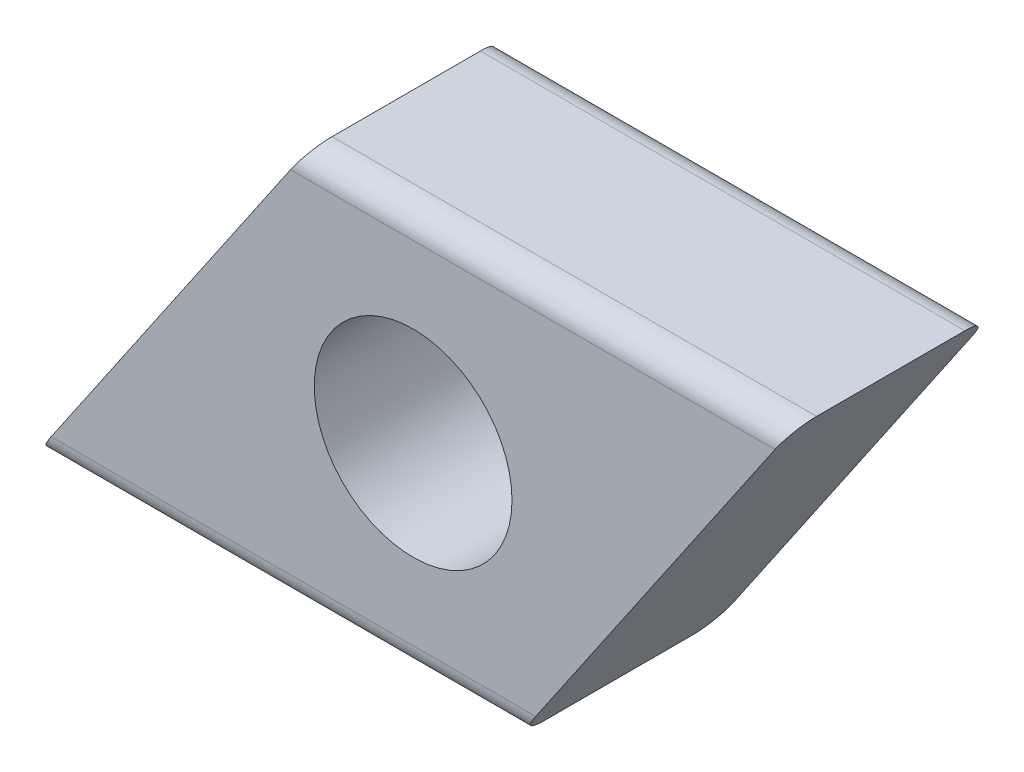
ISO-10303-21;
HEADER;
FILE_DESCRIPTION(('STEP AP214'),'2;1');
FILE_NAME('part.step','',(''),(''),'','','');
FILE_SCHEMA(('AUTOMOTIVE_DESIGN { 1 0 10303 214 1 1 1 1 }'));
ENDSEC;
DATA;
#1=APPLICATION_CONTEXT('core data for automotive mechanical design processes');
#2=APPLICATION_PROTOCOL_DEFINITION('international standard','automotive_design',2000,#1);
#3=PRODUCT_CONTEXT('',#1,'mechanical');
#4=PRODUCT('Part','Part','',(#3));
#5=PRODUCT_RELATED_PRODUCT_CATEGORY('part','',(#4));
#6=PRODUCT_DEFINITION_FORMATION('','',#4);
#7=PRODUCT_DEFINITION_CONTEXT('part definition',#1,'design');
#8=PRODUCT_DEFINITION('design','',#6,#7);
#9=PRODUCT_DEFINITION_SHAPE('','',#8);
#10=(LENGTH_UNIT() NAMED_UNIT(*) SI_UNIT(.MILLI.,.METRE.));
#11=(NAMED_UNIT(*) PLANE_ANGLE_UNIT() SI_UNIT($,.RADIAN.));
#12=(NAMED_UNIT(*) SI_UNIT($,.STERADIAN.) SOLID_ANGLE_UNIT());
#13=UNCERTAINTY_MEASURE_WITH_UNIT(LENGTH_MEASURE(1.E-05),#10,'distance_accuracy_value','');
#14=(GEOMETRIC_REPRESENTATION_CONTEXT(3) GLOBAL_UNCERTAINTY_ASSIGNED_CONTEXT((#13)) GLOBAL_UNIT_ASSIGNED_CONTEXT((#10,
#11,#12)) REPRESENTATION_CONTEXT('',''));
#15=CARTESIAN_POINT('',(0.,0.,0.));
#16=DIRECTION('',(0.,0.,1.));
#17=DIRECTION('',(1.,0.,0.));
#18=AXIS2_PLACEMENT_3D('',#15,#16,#17);
#19=CARTESIAN_POINT('',(0.,-1.11022302462516E-13,4.00000000000045));
#20=DIRECTION('',(0.826146788634581,-0.563454952617134,0.));
#21=DIRECTION('',(0.563454952617132,0.826146788634582,0.));
#22=AXIS2_PLACEMENT_3D('',#19,#20,#21);
#23=PLANE('',#22);
#24=DIRECTION('',(0.,0.,-0.999999999999999));
#25=VECTOR('',#24,1.);
#26=CARTESIAN_POINT('',(5.5218585356489,8.09623852861907,3.99999999999989));
#27=LINE('',#26,#25);
#28=CARTESIAN_POINT('',(5.5218585356489,8.09623852861907,3.49999999999995));
#29=VERTEX_POINT('',#28);
#30=CARTESIAN_POINT('',(5.5218585356489,8.09623852861929,0.499999999999834));
#31=VERTEX_POINT('',#30);
#32=EDGE_CURVE('E84',#29,#31,#27,.T.);
#33=ORIENTED_EDGE('',*,*,#32,.T.);
#34=CARTESIAN_POINT('',(5.1808447107653,7.59623852861935,0.499999999999834));
#35=DIRECTION('',(0.826146788634581,-0.563454952617134,0.));
#36=DIRECTION('',(0.563454952617132,0.826146788634582,0.));
#37=AXIS2_PLACEMENT_3D('',#34,#35,#36);
#38=ELLIPSE('',#37,0.605219322859537,0.5);
#39=CARTESIAN_POINT('',(5.1808447107653,7.59623852861935,-1.11022302462516E-13));
#40=VERTEX_POINT('',#39);
#41=EDGE_CURVE('E91',#31,#40,#38,.F.);
#42=ORIENTED_EDGE('',*,*,#41,.T.);
#43=DIRECTION('',(-0.563454952617132,-0.826146788634582,0.));
#44=VECTOR('',#43,1.);
#45=CARTESIAN_POINT('',(0.,0.,0.));
#46=LINE('',#45,#44);
#47=CARTESIAN_POINT('',(0.341013824885383,0.5000000000005,0.));
#48=VERTEX_POINT('',#47);
#49=EDGE_CURVE('E152',#40,#48,#46,.T.);
#50=ORIENTED_EDGE('',*,*,#49,.T.);
#51=CARTESIAN_POINT('',(0.341013824885383,0.500000000000389,0.499999999999945));
#52=DIRECTION('',(0.826146788634581,-0.563454952617134,0.));
#53=DIRECTION('',(-0.563454952617132,-0.826146788634582,0.));
#54=AXIS2_PLACEMENT_3D('',#51,#52,#53);
#55=ELLIPSE('',#54,0.605219322859537,0.5);
#56=CARTESIAN_POINT('',(0.,0.,0.499999999999945));
#57=VERTEX_POINT('',#56);
#58=EDGE_CURVE('E92',#48,#57,#55,.F.);
#59=ORIENTED_EDGE('',*,*,#58,.T.);
#60=DIRECTION('',(0.,0.,-0.999999999999999));
#61=VECTOR('',#60,1.);
#62=CARTESIAN_POINT('',(0.,-1.11022302462516E-13,4.00000000000045));
#63=LINE('',#62,#61);
#64=CARTESIAN_POINT('',(0.,-1.11022302462516E-13,3.5000000000005));
#65=VERTEX_POINT('',#64);
#66=EDGE_CURVE('E108',#65,#57,#63,.T.);
#67=ORIENTED_EDGE('',*,*,#66,.F.);
#68=CARTESIAN_POINT('',(0.341013824884939,0.500000000000389,3.50000000000006));
#69=DIRECTION('',(0.826146788634581,-0.563454952617134,0.));
#70=DIRECTION('',(0.563454952617132,0.826146788634582,0.));
#71=AXIS2_PLACEMENT_3D('',#68,#69,#70);
#72=ELLIPSE('',#71,0.605219322859537,0.5);
#73=CARTESIAN_POINT('',(0.341013824884939,0.500000000000389,4.00000000000045));
#74=VERTEX_POINT('',#73);
#75=EDGE_CURVE('E110',#65,#74,#72,.F.);
#76=ORIENTED_EDGE('',*,*,#75,.T.);
#77=DIRECTION('',(-0.563454952617132,-0.826146788634582,0.));
#78=VECTOR('',#77,1.);
#79=CARTESIAN_POINT('',(0.,-1.11022302462516E-13,4.00000000000045));
#80=LINE('',#79,#78);
#81=CARTESIAN_POINT('',(5.1808447107653,7.59623852861868,3.99999999999989));
#82=VERTEX_POINT('',#81);
#83=EDGE_CURVE('E86',#82,#74,#80,.T.);
#84=ORIENTED_EDGE('',*,*,#83,.F.);
#85=CARTESIAN_POINT('',(5.1808447107653,7.59623852861868,3.49999999999995));
#86=DIRECTION('',(0.826146788634581,-0.563454952617134,0.));
#87=DIRECTION('',(-0.563454952617132,-0.826146788634582,0.));
#88=AXIS2_PLACEMENT_3D('',#85,#86,#87);
#89=ELLIPSE('',#88,0.605219322859537,0.5);
#90=EDGE_CURVE('E82',#82,#29,#89,.F.);
#91=ORIENTED_EDGE('',*,*,#90,.T.);
#92=EDGE_LOOP('',(#33,#42,#50,#59,#67,#76,#84,#91));
#93=FACE_BOUND('',#92,.T.);
#94=ADVANCED_FACE('F16',(#93),#23,.F.);
#95=CARTESIAN_POINT('',(0.,-1.11022302462516E-13,4.00000000000045));
#96=DIRECTION('',(0.,1.,0.));
#97=DIRECTION('',(0.,0.,0.999999999999999));
#98=AXIS2_PLACEMENT_3D('',#95,#96,#97);
#99=PLANE('',#98);
#100=ORIENTED_EDGE('',*,*,#66,.T.);
#101=DIRECTION('',(1.,0.,0.));
#102=VECTOR('',#101,1.);
#103=CARTESIAN_POINT('',(9.80000000000003,0.,0.499999999999834));
#104=LINE('',#103,#102);
#105=CARTESIAN_POINT('',(9.80000000000003,0.,0.499999999999834));
#106=VERTEX_POINT('',#105);
#107=EDGE_CURVE('E11',#57,#106,#104,.T.);
#108=ORIENTED_EDGE('',*,*,#107,.T.);
#109=DIRECTION('',(0.,0.,-0.999999999999999));
#110=VECTOR('',#109,1.);
#111=CARTESIAN_POINT('',(9.80000000000003,0.,3.99999999999989));
#112=LINE('',#111,#110);
#113=CARTESIAN_POINT('',(9.80000000000003,0.,3.49999999999995));
#114=VERTEX_POINT('',#113);
#115=EDGE_CURVE('E113',#114,#106,#112,.T.);
#116=ORIENTED_EDGE('',*,*,#115,.F.);
#117=DIRECTION('',(1.,0.,0.));
#118=VECTOR('',#117,1.);
#119=CARTESIAN_POINT('',(0.,-1.11022302462516E-13,3.5000000000005));
#120=LINE('',#119,#118);
#121=EDGE_CURVE('E24',#114,#65,#120,.F.);
#122=ORIENTED_EDGE('',*,*,#121,.T.);
#123=EDGE_LOOP('',(#100,#108,#116,#122));
#124=FACE_BOUND('',#123,.T.);
#125=ADVANCED_FACE('F136',(#124),#99,.F.);
#126=CARTESIAN_POINT('',(9.80000000000003,0.,3.99999999999989));
#127=DIRECTION('',(-0.826146788634581,0.563454952617134,0.));
#128=DIRECTION('',(-0.563454952617132,-0.826146788634582,0.));
#129=AXIS2_PLACEMENT_3D('',#126,#127,#128);
#130=PLANE('',#129);
#131=DIRECTION('',(0.563454952617132,0.826146788634582,0.));
#132=VECTOR('',#131,1.);
#133=CARTESIAN_POINT('',(9.80000000000003,0.,-1.11022302462516E-13));
#134=LINE('',#133,#132);
#135=CARTESIAN_POINT('',(10.1410138248852,0.500000000000056,-1.11022302462516E-13));
#136=VERTEX_POINT('',#135);
#137=CARTESIAN_POINT('',(14.9808447107638,7.59623852861935,-7.91033905045424E-13));
#138=VERTEX_POINT('',#137);
#139=EDGE_CURVE('E148',#136,#138,#134,.T.);
#140=ORIENTED_EDGE('',*,*,#139,.T.);
#141=CARTESIAN_POINT('',(14.9808447107638,7.59623852861935,0.499999999999154));
#142=DIRECTION('',(-0.826146788634581,0.563454952617134,0.));
#143=DIRECTION('',(0.563454952617132,0.826146788634582,0.));
#144=AXIS2_PLACEMENT_3D('',#141,#142,#143);
#145=ELLIPSE('',#144,0.605219322859537,0.5);
#146=CARTESIAN_POINT('',(15.3218585356478,8.09623852861885,0.499999999999945));
#147=VERTEX_POINT('',#146);
#148=EDGE_CURVE('E127',#138,#147,#145,.F.);
#149=ORIENTED_EDGE('',*,*,#148,.T.);
#150=DIRECTION('',(0.,0.,-0.999999999999999));
#151=VECTOR('',#150,1.);
#152=CARTESIAN_POINT('',(15.3218585356483,8.09623852861863,3.99999999999989));
#153=LINE('',#152,#151);
#154=CARTESIAN_POINT('',(15.321858535648,8.09623852861863,3.49999999999995));
#155=VERTEX_POINT('',#154);
#156=EDGE_CURVE('E102',#155,#147,#153,.T.);
#157=ORIENTED_EDGE('',*,*,#156,.F.);
#158=CARTESIAN_POINT('',(14.980844710764,7.59623852861868,3.49999999999971));
#159=DIRECTION('',(-0.826146788634581,0.563454952617134,0.));
#160=DIRECTION('',(-0.563454952617132,-0.826146788634582,0.));
#161=AXIS2_PLACEMENT_3D('',#158,#159,#160);
#162=ELLIPSE('',#161,0.605219322859537,0.5);
#163=CARTESIAN_POINT('',(14.980844710764,7.59623852861868,3.99999999999966));
#164=VERTEX_POINT('',#163);
#165=EDGE_CURVE('E107',#155,#164,#162,.F.);
#166=ORIENTED_EDGE('',*,*,#165,.T.);
#167=DIRECTION('',(0.563454952617132,0.826146788634582,0.));
#168=VECTOR('',#167,1.);
#169=CARTESIAN_POINT('',(9.80000000000003,0.,3.99999999999989));
#170=LINE('',#169,#168);
#171=CARTESIAN_POINT('',(10.1410138248854,0.499999999999945,3.99999999999989));
#172=VERTEX_POINT('',#171);
#173=EDGE_CURVE('E103',#172,#164,#170,.T.);
#174=ORIENTED_EDGE('',*,*,#173,.F.);
#175=CARTESIAN_POINT('',(10.1410138248854,0.499999999999945,3.49999999999995));
#176=DIRECTION('',(-0.826146788634581,0.563454952617134,0.));
#177=DIRECTION('',(0.563454952617132,0.826146788634582,0.));
#178=AXIS2_PLACEMENT_3D('',#175,#176,#177);
#179=ELLIPSE('',#178,0.605219322859537,0.5);
#180=EDGE_CURVE('E38',#172,#114,#179,.F.);
#181=ORIENTED_EDGE('',*,*,#180,.T.);
#182=ORIENTED_EDGE('',*,*,#115,.T.);
#183=CARTESIAN_POINT('',(10.1410138248852,0.500000000000056,0.499999999999834));
#184=DIRECTION('',(-0.826146788634581,0.563454952617134,0.));
#185=DIRECTION('',(-0.563454952617132,-0.826146788634582,0.));
#186=AXIS2_PLACEMENT_3D('',#183,#184,#185);
#187=ELLIPSE('',#186,0.605219322859537,0.5);
#188=EDGE_CURVE('E31',#106,#136,#187,.F.);
#189=ORIENTED_EDGE('',*,*,#188,.T.);
#190=EDGE_LOOP('',(#140,#149,#157,#166,#174,#181,#182,#189));
#191=FACE_BOUND('',#190,.T.);
#192=ADVANCED_FACE('F146',(#191),#130,.F.);
#193=CARTESIAN_POINT('',(5.5218585356489,8.09623852861907,3.99999999999989));
#194=DIRECTION('',(0.,-1.,0.));
#195=DIRECTION('',(0.,0.,-0.999999999999999));
#196=AXIS2_PLACEMENT_3D('',#193,#194,#195);
#197=PLANE('',#196);
#198=ORIENTED_EDGE('',*,*,#156,.T.);
#199=DIRECTION('',(-1.,0.,0.));
#200=VECTOR('',#199,1.);
#201=CARTESIAN_POINT('',(5.5218585356489,8.09623852861929,0.499999999999834));
#202=LINE('',#201,#200);
#203=EDGE_CURVE('E101',#147,#31,#202,.T.);
#204=ORIENTED_EDGE('',*,*,#203,.T.);
#205=ORIENTED_EDGE('',*,*,#32,.F.);
#206=DIRECTION('',(-1.,0.,0.));
#207=VECTOR('',#206,1.);
#208=CARTESIAN_POINT('',(5.5218585356489,8.09623852861907,3.49999999999995));
#209=LINE('',#208,#207);
#210=EDGE_CURVE('E98',#29,#155,#209,.F.);
#211=ORIENTED_EDGE('',*,*,#210,.T.);
#212=EDGE_LOOP('',(#198,#204,#205,#211));
#213=FACE_BOUND('',#212,.T.);
#214=ADVANCED_FACE('F97',(#213),#197,.F.);
#215=CARTESIAN_POINT('',(5.5218585356489,8.09623852861907,3.99999999999989));
#216=DIRECTION('',(0.,0.,-0.999999999999999));
#217=DIRECTION('',(-1.,0.,0.));
#218=AXIS2_PLACEMENT_3D('',#215,#216,#217);
#219=PLANE('',#218);
#220=CARTESIAN_POINT('',(7.66092926782402,4.0481192643097,3.99999999999989));
#221=DIRECTION('',(0.,0.,0.999999999999999));
#222=DIRECTION('',(1.,0.,0.));
#223=AXIS2_PLACEMENT_3D('',#220,#221,#222);
#224=CIRCLE('',#223,2.);
#225=CARTESIAN_POINT('',(9.66092926782425,4.04811926430992,3.99999999999989));
#226=VERTEX_POINT('',#225);
#227=EDGE_CURVE('E242',#226,#226,#224,.T.);
#228=ORIENTED_EDGE('',*,*,#227,.F.);
#229=EDGE_LOOP('',(#228));
#230=FACE_BOUND('',#229,.T.);
#231=ORIENTED_EDGE('',*,*,#173,.T.);
#232=DIRECTION('',(-1.,0.,0.));
#233=VECTOR('',#232,1.);
#234=CARTESIAN_POINT('',(5.52185853564691,7.5962385286189,3.99999999999989));
#235=LINE('',#234,#233);
#236=EDGE_CURVE('E132',#164,#82,#235,.T.);
#237=ORIENTED_EDGE('',*,*,#236,.T.);
#238=ORIENTED_EDGE('',*,*,#83,.T.);
#239=DIRECTION('',(1.,0.,0.));
#240=VECTOR('',#239,1.);
#241=CARTESIAN_POINT('',(5.5218585356489,0.5,3.99999999999989));
#242=LINE('',#241,#240);
#243=EDGE_CURVE('E129',#74,#172,#242,.T.);
#244=ORIENTED_EDGE('',*,*,#243,.T.);
#245=EDGE_LOOP('',(#231,#237,#238,#244));
#246=FACE_BOUND('',#245,.T.);
#247=ADVANCED_FACE('F144',(#230,#246),#219,.F.);
#248=CARTESIAN_POINT('',(5.5218585356489,8.09623852861929,-1.11022302462516E-13));
#249=DIRECTION('',(0.,0.,-0.999999999999999));
#250=DIRECTION('',(-1.,0.,0.));
#251=AXIS2_PLACEMENT_3D('',#248,#249,#250);
#252=PLANE('',#251);
#253=CARTESIAN_POINT('',(7.66092926782425,4.04811926430992,-1.11022302462516E-13));
#254=DIRECTION('',(0.,0.,0.999999999999999));
#255=DIRECTION('',(1.,0.,0.));
#256=AXIS2_PLACEMENT_3D('',#253,#254,#255);
#257=CIRCLE('',#256,2.);
#258=CARTESIAN_POINT('',(9.66092926782425,4.04811926430992,-1.1153523558409E-13));
#259=VERTEX_POINT('',#258);
#260=EDGE_CURVE('E154',#259,#259,#257,.T.);
#261=ORIENTED_EDGE('',*,*,#260,.T.);
#262=EDGE_LOOP('',(#261));
#263=FACE_BOUND('',#262,.T.);
#264=ORIENTED_EDGE('',*,*,#49,.F.);
#265=DIRECTION('',(-1.,0.,0.));
#266=VECTOR('',#265,1.);
#267=CARTESIAN_POINT('',(15.321858535648,7.5962385286189,-1.11022302462516E-13));
#268=LINE('',#267,#266);
#269=EDGE_CURVE('E122',#40,#138,#268,.F.);
#270=ORIENTED_EDGE('',*,*,#269,.T.);
#271=ORIENTED_EDGE('',*,*,#139,.F.);
#272=DIRECTION('',(1.,0.,0.));
#273=VECTOR('',#272,1.);
#274=CARTESIAN_POINT('',(2.88657986402541E-12,0.500000000000056,0.));
#275=LINE('',#274,#273);
#276=EDGE_CURVE('E120',#136,#48,#275,.F.);
#277=ORIENTED_EDGE('',*,*,#276,.T.);
#278=EDGE_LOOP('',(#264,#270,#271,#277));
#279=FACE_BOUND('',#278,.T.);
#280=ADVANCED_FACE('F160',(#263,#279),#252,.T.);
#281=CARTESIAN_POINT('',(7.66092926782425,4.04811926430992,-1.11022302462516E-13));
#282=DIRECTION('',(0.,0.,0.999999999999999));
#283=DIRECTION('',(1.,0.,0.));
#284=AXIS2_PLACEMENT_3D('',#281,#282,#283);
#285=CYLINDRICAL_SURFACE('',#284,2.);
#286=CARTESIAN_POINT('',(9.66092926782425,4.04811926430992,-1.1153523558409E-13));
#287=CARTESIAN_POINT('',(9.66092926782425,4.04811926430992,0.0416666666665552));
#288=CARTESIAN_POINT('',(9.66092926782425,4.04811926430992,0.0833333333332219));
#289=CARTESIAN_POINT('',(9.66092926782425,4.04811926430992,0.166666666666555));
#290=CARTESIAN_POINT('',(9.66092926782425,4.04811926430992,0.208333333333222));
#291=CARTESIAN_POINT('',(9.66092926782425,4.04811926430992,0.291666666666555));
#292=CARTESIAN_POINT('',(9.66092926782425,4.04811926430992,0.333333333333222));
#293=CARTESIAN_POINT('',(9.66092926782425,4.04811926430992,0.416666666666555));
#294=CARTESIAN_POINT('',(9.66092926782425,4.04811926430992,0.458333333333222));
#295=CARTESIAN_POINT('',(9.66092926782425,4.04811926430992,0.541666666666556));
#296=CARTESIAN_POINT('',(9.66092926782425,4.04811926430992,0.583333333333222));
#297=CARTESIAN_POINT('',(9.66092926782425,4.04811926430992,0.666666666666556));
#298=CARTESIAN_POINT('',(9.66092926782425,4.04811926430992,0.708333333333222));
#299=CARTESIAN_POINT('',(9.66092926782425,4.04811926430992,0.791666666666556));
#300=CARTESIAN_POINT('',(9.66092926782425,4.04811926430992,0.833333333333222));
#301=CARTESIAN_POINT('',(9.66092926782425,4.04811926430992,0.916666666666556));
#302=CARTESIAN_POINT('',(9.66092926782425,4.04811926430992,0.958333333333222));
#303=CARTESIAN_POINT('',(9.66092926782425,4.04811926430992,1.04166666666656));
#304=CARTESIAN_POINT('',(9.66092926782425,4.04811926430992,1.08333333333322));
#305=CARTESIAN_POINT('',(9.66092926782425,4.04811926430992,1.16666666666656));
#306=CARTESIAN_POINT('',(9.66092926782425,4.04811926430992,1.20833333333322));
#307=CARTESIAN_POINT('',(9.66092926782425,4.04811926430992,1.29166666666656));
#308=CARTESIAN_POINT('',(9.66092926782425,4.04811926430992,1.33333333333322));
#309=CARTESIAN_POINT('',(9.66092926782425,4.04811926430992,1.41666666666656));
#310=CARTESIAN_POINT('',(9.66092926782425,4.04811926430992,1.45833333333322));
#311=CARTESIAN_POINT('',(9.66092926782425,4.04811926430992,1.54166666666656));
#312=CARTESIAN_POINT('',(9.66092926782425,4.04811926430992,1.58333333333322));
#313=CARTESIAN_POINT('',(9.66092926782425,4.04811926430992,1.66666666666656));
#314=CARTESIAN_POINT('',(9.66092926782425,4.04811926430992,1.70833333333322));
#315=CARTESIAN_POINT('',(9.66092926782425,4.04811926430992,1.79166666666656));
#316=CARTESIAN_POINT('',(9.66092926782425,4.04811926430992,1.83333333333322));
#317=CARTESIAN_POINT('',(9.66092926782425,4.04811926430992,1.91666666666656));
#318=CARTESIAN_POINT('',(9.66092926782425,4.04811926430992,1.95833333333322));
#319=CARTESIAN_POINT('',(9.66092926782425,4.04811926430992,2.04166666666656));
#320=CARTESIAN_POINT('',(9.66092926782425,4.04811926430992,2.08333333333322));
#321=CARTESIAN_POINT('',(9.66092926782425,4.04811926430992,2.16666666666656));
#322=CARTESIAN_POINT('',(9.66092926782425,4.04811926430992,2.20833333333322));
#323=CARTESIAN_POINT('',(9.66092926782425,4.04811926430992,2.29166666666656));
#324=CARTESIAN_POINT('',(9.66092926782425,4.04811926430992,2.33333333333322));
#325=CARTESIAN_POINT('',(9.66092926782425,4.04811926430992,2.41666666666656));
#326=CARTESIAN_POINT('',(9.66092926782425,4.04811926430992,2.45833333333322));
#327=CARTESIAN_POINT('',(9.66092926782425,4.04811926430992,2.54166666666656));
#328=CARTESIAN_POINT('',(9.66092926782425,4.04811926430992,2.58333333333322));
#329=CARTESIAN_POINT('',(9.66092926782425,4.04811926430992,2.66666666666656));
#330=CARTESIAN_POINT('',(9.66092926782425,4.04811926430992,2.70833333333322));
#331=CARTESIAN_POINT('',(9.66092926782425,4.04811926430992,2.79166666666656));
#332=CARTESIAN_POINT('',(9.66092926782425,4.04811926430992,2.83333333333322));
#333=CARTESIAN_POINT('',(9.66092926782425,4.04811926430992,2.91666666666656));
#334=CARTESIAN_POINT('',(9.66092926782425,4.04811926430992,2.95833333333322));
#335=CARTESIAN_POINT('',(9.66092926782425,4.04811926430992,3.04166666666656));
#336=CARTESIAN_POINT('',(9.66092926782425,4.04811926430992,3.08333333333322));
#337=CARTESIAN_POINT('',(9.66092926782425,4.04811926430992,3.16666666666656));
#338=CARTESIAN_POINT('',(9.66092926782425,4.04811926430992,3.20833333333322));
#339=CARTESIAN_POINT('',(9.66092926782425,4.04811926430992,3.29166666666656));
#340=CARTESIAN_POINT('',(9.66092926782425,4.04811926430992,3.33333333333322));
#341=CARTESIAN_POINT('',(9.66092926782425,4.04811926430992,3.41666666666656));
#342=CARTESIAN_POINT('',(9.66092926782425,4.04811926430992,3.45833333333322));
#343=CARTESIAN_POINT('',(9.66092926782425,4.04811926430992,3.54166666666656));
#344=CARTESIAN_POINT('',(9.66092926782425,4.04811926430992,3.58333333333322));
#345=CARTESIAN_POINT('',(9.66092926782425,4.04811926430992,3.66666666666656));
#346=CARTESIAN_POINT('',(9.66092926782425,4.04811926430992,3.70833333333322));
#347=CARTESIAN_POINT('',(9.66092926782425,4.04811926430992,3.79166666666656));
#348=CARTESIAN_POINT('',(9.66092926782425,4.04811926430992,3.83333333333322));
#349=CARTESIAN_POINT('',(9.66092926782425,4.04811926430992,3.91666666666656));
#350=CARTESIAN_POINT('',(9.66092926782425,4.04811926430992,3.95833333333323));
#351=CARTESIAN_POINT('',(9.66092926782425,4.04811926430992,3.99999999999989));
#352=B_SPLINE_CURVE_WITH_KNOTS('',3,(#286,#287,#288,#289,#290,#291,#292,#293,#294,#295,#296,
#297,#298,#299,#300,#301,#302,#303,#304,#305,#306,#307,#308,#309,#310,#311,#312,#313,#314,#315,
#316,#317,#318,#319,#320,#321,#322,#323,#324,#325,#326,#327,#328,#329,#330,#331,#332,#333,#334,
#335,#336,#337,#338,#339,#340,#341,#342,#343,#344,#345,#346,#347,#348,#349,#350,#351),
.UNSPECIFIED.,.F.,.F.,(4,2,2,2,2,2,2,2,2,2,2,2,2,2,2,2,2,2,2,2,2,2,2,2,2,2,2,2,2,2,2,2,4),(0.,
0.125,0.25,0.375,0.5,0.625000000000001,0.750000000000001,0.875000000000001,1.,1.125,1.25,1.375,
1.5,1.625,1.75,1.875,2.,2.125,2.25,2.375,2.5,2.625,2.75,2.875,3.,3.125,3.25,3.375,3.5,3.625,
3.75,3.875,4.),.UNSPECIFIED.);
#353=EDGE_CURVE('BSEAM180',#259,#226,#352,.T.);
#354=ORIENTED_EDGE('',*,*,#260,.F.);
#355=ORIENTED_EDGE('',*,*,#227,.T.);
#356=ORIENTED_EDGE('',*,*,#353,.T.);
#357=ORIENTED_EDGE('',*,*,#353,.F.);
#358=EDGE_LOOP('',(#354,#356,#355,#357));
#359=FACE_BOUND('',#358,.T.);
#360=ADVANCED_FACE('F180',(#359),#285,.F.);
#361=CARTESIAN_POINT('',(5.52185853564691,7.5962385286189,0.499999999999834));
#362=DIRECTION('',(1.,0.,0.));
#363=DIRECTION('',(0.,0.,-0.999999999999999));
#364=AXIS2_PLACEMENT_3D('',#361,#362,#363);
#365=CYLINDRICAL_SURFACE('',#364,0.5);
#366=ORIENTED_EDGE('',*,*,#148,.F.);
#367=ORIENTED_EDGE('',*,*,#269,.F.);
#368=ORIENTED_EDGE('',*,*,#41,.F.);
#369=ORIENTED_EDGE('',*,*,#203,.F.);
#370=EDGE_LOOP('',(#366,#367,#368,#369));
#371=FACE_BOUND('',#370,.T.);
#372=ADVANCED_FACE('F169',(#371),#365,.T.);
#373=CARTESIAN_POINT('',(5.52185853564691,7.5962385286189,3.49999999999995));
#374=DIRECTION('',(-1.,0.,0.));
#375=DIRECTION('',(0.,0.,0.999999999999999));
#376=AXIS2_PLACEMENT_3D('',#373,#374,#375);
#377=CYLINDRICAL_SURFACE('',#376,0.5);
#378=ORIENTED_EDGE('',*,*,#165,.F.);
#379=ORIENTED_EDGE('',*,*,#210,.F.);
#380=ORIENTED_EDGE('',*,*,#90,.F.);
#381=ORIENTED_EDGE('',*,*,#236,.F.);
#382=EDGE_LOOP('',(#378,#379,#380,#381));
#383=FACE_BOUND('',#382,.T.);
#384=ADVANCED_FACE('F106',(#383),#377,.T.);
#385=CARTESIAN_POINT('',(2.22044604925031E-12,0.500000000000056,0.499999999999945));
#386=DIRECTION('',(-1.,0.,0.));
#387=DIRECTION('',(0.,0.,0.999999999999999));
#388=AXIS2_PLACEMENT_3D('',#385,#386,#387);
#389=CYLINDRICAL_SURFACE('',#388,0.5);
#390=ORIENTED_EDGE('',*,*,#58,.F.);
#391=ORIENTED_EDGE('',*,*,#276,.F.);
#392=ORIENTED_EDGE('',*,*,#188,.F.);
#393=ORIENTED_EDGE('',*,*,#107,.F.);
#394=EDGE_LOOP('',(#390,#391,#392,#393));
#395=FACE_BOUND('',#394,.T.);
#396=ADVANCED_FACE('F162',(#395),#389,.T.);
#397=CARTESIAN_POINT('',(5.5218585356489,0.5,3.49999999999995));
#398=DIRECTION('',(1.,0.,0.));
#399=DIRECTION('',(0.,0.,-0.999999999999999));
#400=AXIS2_PLACEMENT_3D('',#397,#398,#399);
#401=CYLINDRICAL_SURFACE('',#400,0.5);
#402=ORIENTED_EDGE('',*,*,#75,.F.);
#403=ORIENTED_EDGE('',*,*,#121,.F.);
#404=ORIENTED_EDGE('',*,*,#180,.F.);
#405=ORIENTED_EDGE('',*,*,#243,.F.);
#406=EDGE_LOOP('',(#402,#403,#404,#405));
#407=FACE_BOUND('',#406,.T.);
#408=ADVANCED_FACE('F18',(#407),#401,.T.);
#409=CLOSED_SHELL('',(#94,#125,#192,#214,#247,#280,#360,#372,#384,#396,#408));
#410=MANIFOLD_SOLID_BREP('B1',#409);
#411=ADVANCED_BREP_SHAPE_REPRESENTATION('',(#18,#410),#14);
#412=SHAPE_DEFINITION_REPRESENTATION(#9,#411);
ENDSEC;
END-ISO-10303-21;
